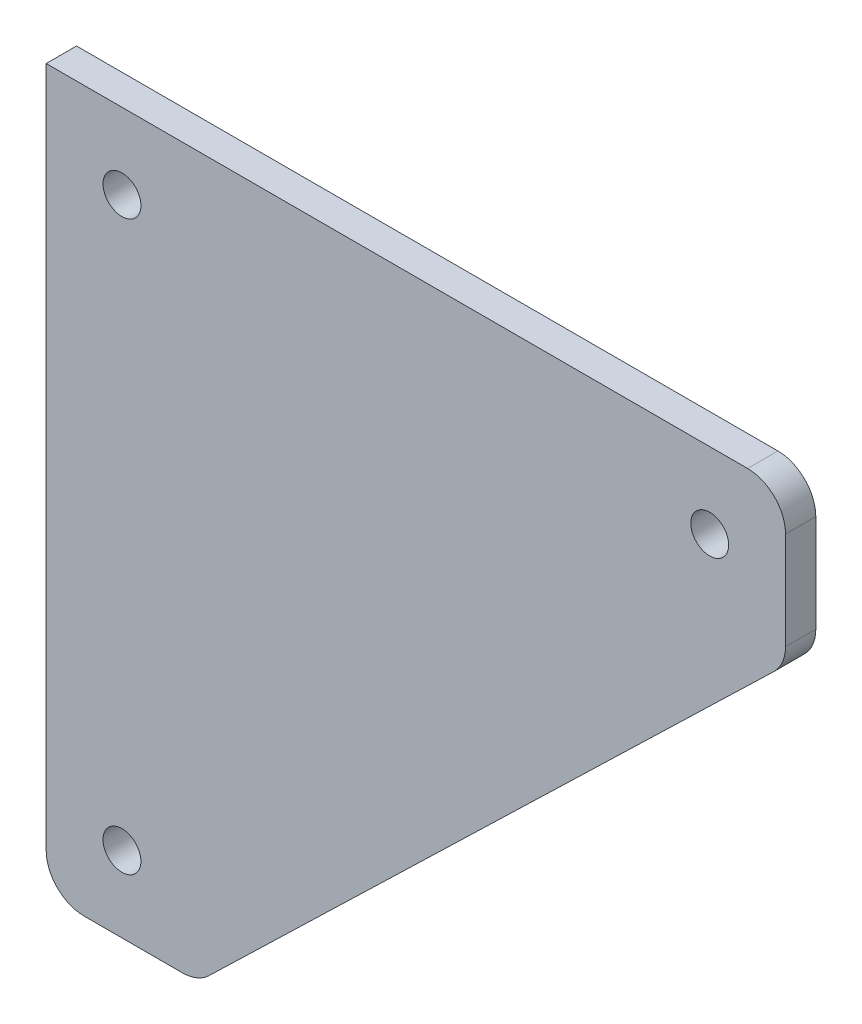
ISO-10303-21;
HEADER;
FILE_DESCRIPTION(('STEP AP214'),'2;1');
FILE_NAME('part.step','',(''),(''),'','','');
FILE_SCHEMA(('AUTOMOTIVE_DESIGN { 1 0 10303 214 1 1 1 1 }'));
ENDSEC;
DATA;
#1=APPLICATION_CONTEXT('core data for automotive mechanical design processes');
#2=APPLICATION_PROTOCOL_DEFINITION('international standard','automotive_design',2000,#1);
#3=PRODUCT_CONTEXT('',#1,'mechanical');
#4=PRODUCT('Part','Part','',(#3));
#5=PRODUCT_RELATED_PRODUCT_CATEGORY('part','',(#4));
#6=PRODUCT_DEFINITION_FORMATION('','',#4);
#7=PRODUCT_DEFINITION_CONTEXT('part definition',#1,'design');
#8=PRODUCT_DEFINITION('design','',#6,#7);
#9=PRODUCT_DEFINITION_SHAPE('','',#8);
#10=(LENGTH_UNIT() NAMED_UNIT(*) SI_UNIT(.MILLI.,.METRE.));
#11=(NAMED_UNIT(*) PLANE_ANGLE_UNIT() SI_UNIT($,.RADIAN.));
#12=(NAMED_UNIT(*) SI_UNIT($,.STERADIAN.) SOLID_ANGLE_UNIT());
#13=UNCERTAINTY_MEASURE_WITH_UNIT(LENGTH_MEASURE(1.E-05),#10,'distance_accuracy_value','');
#14=(GEOMETRIC_REPRESENTATION_CONTEXT(3) GLOBAL_UNCERTAINTY_ASSIGNED_CONTEXT((#13)) GLOBAL_UNIT_ASSIGNED_CONTEXT((#10,
#11,#12)) REPRESENTATION_CONTEXT('',''));
#15=CARTESIAN_POINT('',(0.,0.,0.));
#16=DIRECTION('',(0.,0.,1.));
#17=DIRECTION('',(1.,0.,0.));
#18=AXIS2_PLACEMENT_3D('',#15,#16,#17);
#19=CARTESIAN_POINT('',(-46.4575894502902,-53.7984404291404,4.));
#20=DIRECTION('',(1.,0.,0.));
#21=DIRECTION('',(0.,1.,0.));
#22=AXIS2_PLACEMENT_3D('',#19,#20,#21);
#23=PLANE('',#22);
#24=DIRECTION('',(0.,-1.,0.));
#25=VECTOR('',#24,1.);
#26=CARTESIAN_POINT('',(-46.4575894502902,-53.7984404291404,0.));
#27=LINE('',#26,#25);
#28=CARTESIAN_POINT('',(-46.4575894502902,41.1510545203546,0.));
#29=VERTEX_POINT('',#28);
#30=CARTESIAN_POINT('',(-46.4575894502902,-48.7984404291404,0.));
#31=VERTEX_POINT('',#30);
#32=EDGE_CURVE('E141',#29,#31,#27,.T.);
#33=ORIENTED_EDGE('',*,*,#32,.T.);
#34=DIRECTION('',(0.,0.,-1.));
#35=VECTOR('',#34,1.);
#36=CARTESIAN_POINT('',(-46.4575894502902,-48.7984404291404,4.));
#37=LINE('',#36,#35);
#38=CARTESIAN_POINT('',(-46.4575894502902,-48.7984404291404,4.));
#39=VERTEX_POINT('',#38);
#40=EDGE_CURVE('E11',#31,#39,#37,.F.);
#41=ORIENTED_EDGE('',*,*,#40,.T.);
#42=DIRECTION('',(0.,-1.,0.));
#43=VECTOR('',#42,1.);
#44=CARTESIAN_POINT('',(-46.4575894502902,-53.7984404291404,4.));
#45=LINE('',#44,#43);
#46=CARTESIAN_POINT('',(-46.4575894502902,41.1510545203546,4.));
#47=VERTEX_POINT('',#46);
#48=EDGE_CURVE('E109',#47,#39,#45,.T.);
#49=ORIENTED_EDGE('',*,*,#48,.F.);
#50=DIRECTION('',(0.,0.,-1.));
#51=VECTOR('',#50,1.);
#52=CARTESIAN_POINT('',(-46.4575894502902,41.1510545203546,4.));
#53=LINE('',#52,#51);
#54=EDGE_CURVE('E116',#47,#29,#53,.T.);
#55=ORIENTED_EDGE('',*,*,#54,.T.);
#56=EDGE_LOOP('',(#33,#41,#49,#55));
#57=FACE_BOUND('',#56,.T.);
#58=ADVANCED_FACE('F33',(#57),#23,.F.);
#59=CARTESIAN_POINT('',(-26.4575894502902,-53.7984404291404,4.));
#60=DIRECTION('',(0.,1.,0.));
#61=DIRECTION('',(-1.,0.,0.));
#62=AXIS2_PLACEMENT_3D('',#59,#60,#61);
#63=PLANE('',#62);
#64=DIRECTION('',(1.,0.,0.));
#65=VECTOR('',#64,1.);
#66=CARTESIAN_POINT('',(-26.4575894502902,-53.7984404291404,0.));
#67=LINE('',#66,#65);
#68=CARTESIAN_POINT('',(-41.4575894502902,-53.7984404291404,0.));
#69=VERTEX_POINT('',#68);
#70=CARTESIAN_POINT('',(-28.4784082332616,-53.7984404291404,0.));
#71=VERTEX_POINT('',#70);
#72=EDGE_CURVE('E143',#69,#71,#67,.T.);
#73=ORIENTED_EDGE('',*,*,#72,.T.);
#74=DIRECTION('',(0.,0.,-1.));
#75=VECTOR('',#74,1.);
#76=CARTESIAN_POINT('',(-28.4784082332616,-53.7984404291404,4.));
#77=LINE('',#76,#75);
#78=CARTESIAN_POINT('',(-28.4784082332616,-53.7984404291404,4.));
#79=VERTEX_POINT('',#78);
#80=EDGE_CURVE('E41',#71,#79,#77,.F.);
#81=ORIENTED_EDGE('',*,*,#80,.T.);
#82=DIRECTION('',(1.,0.,0.));
#83=VECTOR('',#82,1.);
#84=CARTESIAN_POINT('',(-26.4575894502902,-53.7984404291404,4.));
#85=LINE('',#84,#83);
#86=CARTESIAN_POINT('',(-41.4575894502902,-53.7984404291404,4.));
#87=VERTEX_POINT('',#86);
#88=EDGE_CURVE('E129',#87,#79,#85,.T.);
#89=ORIENTED_EDGE('',*,*,#88,.F.);
#90=DIRECTION('',(0.,0.,-1.));
#91=VECTOR('',#90,1.);
#92=CARTESIAN_POINT('',(-41.4575894502902,-53.7984404291404,4.));
#93=LINE('',#92,#91);
#94=EDGE_CURVE('E175',#87,#69,#93,.T.);
#95=ORIENTED_EDGE('',*,*,#94,.T.);
#96=EDGE_LOOP('',(#73,#81,#89,#95));
#97=FACE_BOUND('',#96,.T.);
#98=ADVANCED_FACE('F180',(#97),#63,.F.);
#99=CARTESIAN_POINT('',(51.1181681254674,21.1510545203546,4.));
#100=DIRECTION('',(-0.694828439518466,0.719175527695662,0.));
#101=DIRECTION('',(-0.719175527695662,-0.694828439518466,0.));
#102=AXIS2_PLACEMENT_3D('',#99,#100,#101);
#103=PLANE('',#102);
#104=DIRECTION('',(0.719175527695662,0.694828439518466,0.));
#105=VECTOR('',#104,1.);
#106=CARTESIAN_POINT('',(51.1181681254674,21.1510545203546,0.));
#107=LINE('',#106,#105);
#108=CARTESIAN_POINT('',(-25.0042660356693,-52.3943180676187,0.));
#109=VERTEX_POINT('',#108);
#110=CARTESIAN_POINT('',(49.5923103230598,19.6768533622992,0.));
#111=VERTEX_POINT('',#110);
#112=EDGE_CURVE('E147',#109,#111,#107,.T.);
#113=ORIENTED_EDGE('',*,*,#112,.T.);
#114=DIRECTION('',(0.,0.,-1.));
#115=VECTOR('',#114,1.);
#116=CARTESIAN_POINT('',(49.5923103230598,19.6768533622992,4.));
#117=LINE('',#116,#115);
#118=CARTESIAN_POINT('',(49.5923103230598,19.6768533622992,4.));
#119=VERTEX_POINT('',#118);
#120=EDGE_CURVE('E48',#111,#119,#117,.F.);
#121=ORIENTED_EDGE('',*,*,#120,.T.);
#122=DIRECTION('',(0.719175527695662,0.694828439518466,0.));
#123=VECTOR('',#122,1.);
#124=CARTESIAN_POINT('',(51.1181681254674,21.1510545203546,4.));
#125=LINE('',#124,#123);
#126=CARTESIAN_POINT('',(-25.0042660356693,-52.3943180676187,4.));
#127=VERTEX_POINT('',#126);
#128=EDGE_CURVE('E131',#127,#119,#125,.T.);
#129=ORIENTED_EDGE('',*,*,#128,.F.);
#130=DIRECTION('',(0.,0.,-1.));
#131=VECTOR('',#130,1.);
#132=CARTESIAN_POINT('',(-25.0042660356693,-52.3943180676187,4.));
#133=LINE('',#132,#131);
#134=EDGE_CURVE('E171',#127,#109,#133,.T.);
#135=ORIENTED_EDGE('',*,*,#134,.T.);
#136=EDGE_LOOP('',(#113,#121,#129,#135));
#137=FACE_BOUND('',#136,.T.);
#138=ADVANCED_FACE('F187',(#137),#103,.F.);
#139=CARTESIAN_POINT('',(51.1181681254674,41.1510545203546,4.));
#140=DIRECTION('',(-1.,0.,0.));
#141=DIRECTION('',(0.,0.,1.));
#142=AXIS2_PLACEMENT_3D('',#139,#140,#141);
#143=PLANE('',#142);
#144=DIRECTION('',(0.,1.,0.));
#145=VECTOR('',#144,1.);
#146=CARTESIAN_POINT('',(51.1181681254674,41.1510545203546,0.));
#147=LINE('',#146,#145);
#148=CARTESIAN_POINT('',(51.1181681254674,23.2727310007776,0.));
#149=VERTEX_POINT('',#148);
#150=CARTESIAN_POINT('',(51.1181681254674,36.1510545203546,0.));
#151=VERTEX_POINT('',#150);
#152=EDGE_CURVE('E133',#149,#151,#147,.T.);
#153=ORIENTED_EDGE('',*,*,#152,.T.);
#154=DIRECTION('',(0.,0.,-1.));
#155=VECTOR('',#154,1.);
#156=CARTESIAN_POINT('',(51.1181681254674,36.1510545203546,4.));
#157=LINE('',#156,#155);
#158=CARTESIAN_POINT('',(51.1181681254674,36.1510545203546,4.));
#159=VERTEX_POINT('',#158);
#160=EDGE_CURVE('E163',#151,#159,#157,.F.);
#161=ORIENTED_EDGE('',*,*,#160,.T.);
#162=DIRECTION('',(0.,1.,0.));
#163=VECTOR('',#162,1.);
#164=CARTESIAN_POINT('',(51.1181681254674,41.1510545203546,4.));
#165=LINE('',#164,#163);
#166=CARTESIAN_POINT('',(51.1181681254674,23.2727310007776,4.));
#167=VERTEX_POINT('',#166);
#168=EDGE_CURVE('E117',#167,#159,#165,.T.);
#169=ORIENTED_EDGE('',*,*,#168,.F.);
#170=DIRECTION('',(0.,0.,-1.));
#171=VECTOR('',#170,1.);
#172=CARTESIAN_POINT('',(51.1181681254674,23.2727310007776,4.));
#173=LINE('',#172,#171);
#174=EDGE_CURVE('E160',#167,#149,#173,.T.);
#175=ORIENTED_EDGE('',*,*,#174,.T.);
#176=EDGE_LOOP('',(#153,#161,#169,#175));
#177=FACE_BOUND('',#176,.T.);
#178=ADVANCED_FACE('F197',(#177),#143,.F.);
#179=CARTESIAN_POINT('',(-46.4575894502902,41.1510545203546,4.));
#180=DIRECTION('',(0.,-1.,0.));
#181=DIRECTION('',(0.,0.,-1.));
#182=AXIS2_PLACEMENT_3D('',#179,#180,#181);
#183=PLANE('',#182);
#184=DIRECTION('',(-1.,0.,0.));
#185=VECTOR('',#184,1.);
#186=CARTESIAN_POINT('',(-46.4575894502902,41.1510545203546,4.));
#187=LINE('',#186,#185);
#188=CARTESIAN_POINT('',(46.1181681254674,41.1510545203546,4.));
#189=VERTEX_POINT('',#188);
#190=EDGE_CURVE('E104',#189,#47,#187,.T.);
#191=ORIENTED_EDGE('',*,*,#190,.F.);
#192=DIRECTION('',(0.,0.,-1.));
#193=VECTOR('',#192,1.);
#194=CARTESIAN_POINT('',(46.1181681254674,41.1510545203546,4.));
#195=LINE('',#194,#193);
#196=CARTESIAN_POINT('',(46.1181681254674,41.1510545203546,0.));
#197=VERTEX_POINT('',#196);
#198=EDGE_CURVE('E126',#189,#197,#195,.T.);
#199=ORIENTED_EDGE('',*,*,#198,.T.);
#200=DIRECTION('',(-1.,0.,0.));
#201=VECTOR('',#200,1.);
#202=CARTESIAN_POINT('',(-46.4575894502902,41.1510545203546,0.));
#203=LINE('',#202,#201);
#204=EDGE_CURVE('E122',#197,#29,#203,.T.);
#205=ORIENTED_EDGE('',*,*,#204,.T.);
#206=ORIENTED_EDGE('',*,*,#54,.F.);
#207=EDGE_LOOP('',(#191,#199,#205,#206));
#208=FACE_BOUND('',#207,.T.);
#209=ADVANCED_FACE('F120',(#208),#183,.F.);
#210=CARTESIAN_POINT('',(0.,0.,4.));
#211=DIRECTION('',(0.,0.,-1.));
#212=DIRECTION('',(-1.,0.,0.));
#213=AXIS2_PLACEMENT_3D('',#210,#211,#212);
#214=PLANE('',#213);
#215=CARTESIAN_POINT('',(41.1181681254674,31.1510545203546,4.));
#216=DIRECTION('',(0.,0.,1.));
#217=DIRECTION('',(1.,0.,0.));
#218=AXIS2_PLACEMENT_3D('',#215,#216,#217);
#219=CIRCLE('',#218,2.5);
#220=CARTESIAN_POINT('',(43.6181681254674,31.1510545203546,4.));
#221=VERTEX_POINT('',#220);
#222=EDGE_CURVE('E320',#221,#221,#219,.T.);
#223=ORIENTED_EDGE('',*,*,#222,.F.);
#224=EDGE_LOOP('',(#223));
#225=FACE_BOUND('',#224,.T.);
#226=CARTESIAN_POINT('',(-36.4575894502902,-43.7984404291404,4.));
#227=DIRECTION('',(0.,0.,1.));
#228=DIRECTION('',(1.,0.,0.));
#229=AXIS2_PLACEMENT_3D('',#226,#227,#228);
#230=CIRCLE('',#229,2.5);
#231=CARTESIAN_POINT('',(-33.9575894502902,-43.7984404291404,4.));
#232=VERTEX_POINT('',#231);
#233=EDGE_CURVE('E324',#232,#232,#230,.T.);
#234=ORIENTED_EDGE('',*,*,#233,.F.);
#235=EDGE_LOOP('',(#234));
#236=FACE_BOUND('',#235,.T.);
#237=CARTESIAN_POINT('',(-36.4575894502902,31.1510545203546,4.));
#238=DIRECTION('',(0.,0.,1.));
#239=DIRECTION('',(1.,0.,0.));
#240=AXIS2_PLACEMENT_3D('',#237,#238,#239);
#241=CIRCLE('',#240,2.5);
#242=CARTESIAN_POINT('',(-33.9575894502902,31.1510545203546,4.));
#243=VERTEX_POINT('',#242);
#244=EDGE_CURVE('E136',#243,#243,#241,.T.);
#245=ORIENTED_EDGE('',*,*,#244,.F.);
#246=EDGE_LOOP('',(#245));
#247=FACE_BOUND('',#246,.T.);
#248=ORIENTED_EDGE('',*,*,#168,.T.);
#249=CARTESIAN_POINT('',(46.1181681254674,36.1510545203546,4.));
#250=DIRECTION('',(0.,0.,-1.));
#251=DIRECTION('',(-1.,0.,0.));
#252=AXIS2_PLACEMENT_3D('',#249,#250,#251);
#253=CIRCLE('',#252,5.);
#254=EDGE_CURVE('E112',#159,#189,#253,.F.);
#255=ORIENTED_EDGE('',*,*,#254,.T.);
#256=ORIENTED_EDGE('',*,*,#190,.T.);
#257=ORIENTED_EDGE('',*,*,#48,.T.);
#258=CARTESIAN_POINT('',(-41.4575894502902,-48.7984404291404,4.));
#259=DIRECTION('',(0.,0.,-1.));
#260=DIRECTION('',(-1.,0.,0.));
#261=AXIS2_PLACEMENT_3D('',#258,#259,#260);
#262=CIRCLE('',#261,5.);
#263=EDGE_CURVE('E165',#39,#87,#262,.F.);
#264=ORIENTED_EDGE('',*,*,#263,.T.);
#265=ORIENTED_EDGE('',*,*,#88,.T.);
#266=CARTESIAN_POINT('',(-28.4784082332616,-48.7984404291404,4.));
#267=DIRECTION('',(0.,0.,-1.));
#268=DIRECTION('',(-1.,0.,0.));
#269=AXIS2_PLACEMENT_3D('',#266,#267,#268);
#270=CIRCLE('',#269,5.);
#271=EDGE_CURVE('E55',#79,#127,#270,.F.);
#272=ORIENTED_EDGE('',*,*,#271,.T.);
#273=ORIENTED_EDGE('',*,*,#128,.T.);
#274=CARTESIAN_POINT('',(46.1181681254674,23.2727310007776,4.));
#275=DIRECTION('',(0.,0.,-1.));
#276=DIRECTION('',(-1.,0.,0.));
#277=AXIS2_PLACEMENT_3D('',#274,#275,#276);
#278=CIRCLE('',#277,5.);
#279=EDGE_CURVE('E168',#119,#167,#278,.F.);
#280=ORIENTED_EDGE('',*,*,#279,.T.);
#281=EDGE_LOOP('',(#248,#255,#256,#257,#264,#265,#272,#273,#280));
#282=FACE_BOUND('',#281,.T.);
#283=ADVANCED_FACE('F107',(#225,#236,#247,#282),#214,.F.);
#284=CARTESIAN_POINT('',(0.,0.,0.));
#285=DIRECTION('',(0.,0.,-1.));
#286=DIRECTION('',(-1.,0.,0.));
#287=AXIS2_PLACEMENT_3D('',#284,#285,#286);
#288=PLANE('',#287);
#289=CARTESIAN_POINT('',(41.1181681254674,31.1510545203546,0.));
#290=DIRECTION('',(0.,0.,1.));
#291=DIRECTION('',(1.,0.,0.));
#292=AXIS2_PLACEMENT_3D('',#289,#290,#291);
#293=CIRCLE('',#292,2.5);
#294=CARTESIAN_POINT('',(43.6181681254674,31.1510545203546,0.));
#295=VERTEX_POINT('',#294);
#296=EDGE_CURVE('E328',#295,#295,#293,.T.);
#297=ORIENTED_EDGE('',*,*,#296,.T.);
#298=EDGE_LOOP('',(#297));
#299=FACE_BOUND('',#298,.T.);
#300=CARTESIAN_POINT('',(-36.4575894502902,-43.7984404291404,0.));
#301=DIRECTION('',(0.,0.,1.));
#302=DIRECTION('',(1.,0.,0.));
#303=AXIS2_PLACEMENT_3D('',#300,#301,#302);
#304=CIRCLE('',#303,2.5);
#305=CARTESIAN_POINT('',(-33.9575894502902,-43.7984404291404,0.));
#306=VERTEX_POINT('',#305);
#307=EDGE_CURVE('E333',#306,#306,#304,.T.);
#308=ORIENTED_EDGE('',*,*,#307,.T.);
#309=EDGE_LOOP('',(#308));
#310=FACE_BOUND('',#309,.T.);
#311=CARTESIAN_POINT('',(-36.4575894502902,31.1510545203546,0.));
#312=DIRECTION('',(0.,0.,1.));
#313=DIRECTION('',(1.,0.,0.));
#314=AXIS2_PLACEMENT_3D('',#311,#312,#313);
#315=CIRCLE('',#314,2.5);
#316=CARTESIAN_POINT('',(-33.9575894502902,31.1510545203546,0.));
#317=VERTEX_POINT('',#316);
#318=EDGE_CURVE('E144',#317,#317,#315,.T.);
#319=ORIENTED_EDGE('',*,*,#318,.T.);
#320=EDGE_LOOP('',(#319));
#321=FACE_BOUND('',#320,.T.);
#322=ORIENTED_EDGE('',*,*,#204,.F.);
#323=CARTESIAN_POINT('',(46.1181681254674,36.1510545203546,0.));
#324=DIRECTION('',(0.,0.,-1.));
#325=DIRECTION('',(-1.,0.,0.));
#326=AXIS2_PLACEMENT_3D('',#323,#324,#325);
#327=CIRCLE('',#326,5.);
#328=EDGE_CURVE('E158',#197,#151,#327,.T.);
#329=ORIENTED_EDGE('',*,*,#328,.T.);
#330=ORIENTED_EDGE('',*,*,#152,.F.);
#331=CARTESIAN_POINT('',(46.1181681254674,23.2727310007776,0.));
#332=DIRECTION('',(0.,0.,-1.));
#333=DIRECTION('',(-1.,0.,0.));
#334=AXIS2_PLACEMENT_3D('',#331,#332,#333);
#335=CIRCLE('',#334,5.);
#336=EDGE_CURVE('E156',#149,#111,#335,.T.);
#337=ORIENTED_EDGE('',*,*,#336,.T.);
#338=ORIENTED_EDGE('',*,*,#112,.F.);
#339=CARTESIAN_POINT('',(-28.4784082332616,-48.7984404291404,0.));
#340=DIRECTION('',(0.,0.,-1.));
#341=DIRECTION('',(-1.,0.,0.));
#342=AXIS2_PLACEMENT_3D('',#339,#340,#341);
#343=CIRCLE('',#342,5.);
#344=EDGE_CURVE('E154',#109,#71,#343,.T.);
#345=ORIENTED_EDGE('',*,*,#344,.T.);
#346=ORIENTED_EDGE('',*,*,#72,.F.);
#347=CARTESIAN_POINT('',(-41.4575894502902,-48.7984404291404,0.));
#348=DIRECTION('',(0.,0.,-1.));
#349=DIRECTION('',(-1.,0.,0.));
#350=AXIS2_PLACEMENT_3D('',#347,#348,#349);
#351=CIRCLE('',#350,5.);
#352=EDGE_CURVE('E152',#69,#31,#351,.T.);
#353=ORIENTED_EDGE('',*,*,#352,.T.);
#354=ORIENTED_EDGE('',*,*,#32,.F.);
#355=EDGE_LOOP('',(#322,#329,#330,#337,#338,#345,#346,#353,#354));
#356=FACE_BOUND('',#355,.T.);
#357=ADVANCED_FACE('F189',(#299,#310,#321,#356),#288,.T.);
#358=CARTESIAN_POINT('',(-36.4575894502902,31.1510545203546,0.));
#359=DIRECTION('',(0.,0.,1.));
#360=DIRECTION('',(1.,0.,0.));
#361=AXIS2_PLACEMENT_3D('',#358,#359,#360);
#362=CYLINDRICAL_SURFACE('',#361,2.5);
#363=ORIENTED_EDGE('',*,*,#318,.F.);
#364=EDGE_LOOP('',(#363));
#365=FACE_BOUND('',#364,.T.);
#366=ORIENTED_EDGE('',*,*,#244,.T.);
#367=EDGE_LOOP('',(#366));
#368=FACE_BOUND('',#367,.T.);
#369=ADVANCED_FACE('F256',(#365,#368),#362,.F.);
#370=CARTESIAN_POINT('',(-36.4575894502902,-43.7984404291404,0.));
#371=DIRECTION('',(0.,0.,1.));
#372=DIRECTION('',(1.,0.,0.));
#373=AXIS2_PLACEMENT_3D('',#370,#371,#372);
#374=CYLINDRICAL_SURFACE('',#373,2.5);
#375=ORIENTED_EDGE('',*,*,#307,.F.);
#376=EDGE_LOOP('',(#375));
#377=FACE_BOUND('',#376,.T.);
#378=ORIENTED_EDGE('',*,*,#233,.T.);
#379=EDGE_LOOP('',(#378));
#380=FACE_BOUND('',#379,.T.);
#381=ADVANCED_FACE('F247',(#377,#380),#374,.F.);
#382=CARTESIAN_POINT('',(41.1181681254674,31.1510545203546,0.));
#383=DIRECTION('',(0.,0.,1.));
#384=DIRECTION('',(1.,0.,0.));
#385=AXIS2_PLACEMENT_3D('',#382,#383,#384);
#386=CYLINDRICAL_SURFACE('',#385,2.5);
#387=ORIENTED_EDGE('',*,*,#296,.F.);
#388=EDGE_LOOP('',(#387));
#389=FACE_BOUND('',#388,.T.);
#390=ORIENTED_EDGE('',*,*,#222,.T.);
#391=EDGE_LOOP('',(#390));
#392=FACE_BOUND('',#391,.T.);
#393=ADVANCED_FACE('F217',(#389,#392),#386,.F.);
#394=CARTESIAN_POINT('',(46.1181681254674,36.1510545203546,4.));
#395=DIRECTION('',(0.,0.,-1.));
#396=DIRECTION('',(-1.,0.,0.));
#397=AXIS2_PLACEMENT_3D('',#394,#395,#396);
#398=CYLINDRICAL_SURFACE('',#397,5.);
#399=ORIENTED_EDGE('',*,*,#254,.F.);
#400=ORIENTED_EDGE('',*,*,#160,.F.);
#401=ORIENTED_EDGE('',*,*,#328,.F.);
#402=ORIENTED_EDGE('',*,*,#198,.F.);
#403=EDGE_LOOP('',(#399,#400,#401,#402));
#404=FACE_BOUND('',#403,.T.);
#405=ADVANCED_FACE('F200',(#404),#398,.T.);
#406=CARTESIAN_POINT('',(46.1181681254674,23.2727310007776,4.));
#407=DIRECTION('',(0.,0.,-1.));
#408=DIRECTION('',(-1.,0.,0.));
#409=AXIS2_PLACEMENT_3D('',#406,#407,#408);
#410=CYLINDRICAL_SURFACE('',#409,5.);
#411=ORIENTED_EDGE('',*,*,#279,.F.);
#412=ORIENTED_EDGE('',*,*,#120,.F.);
#413=ORIENTED_EDGE('',*,*,#336,.F.);
#414=ORIENTED_EDGE('',*,*,#174,.F.);
#415=EDGE_LOOP('',(#411,#412,#413,#414));
#416=FACE_BOUND('',#415,.T.);
#417=ADVANCED_FACE('F194',(#416),#410,.T.);
#418=CARTESIAN_POINT('',(-28.4784082332616,-48.7984404291404,4.));
#419=DIRECTION('',(0.,0.,-1.));
#420=DIRECTION('',(-1.,0.,0.));
#421=AXIS2_PLACEMENT_3D('',#418,#419,#420);
#422=CYLINDRICAL_SURFACE('',#421,5.);
#423=ORIENTED_EDGE('',*,*,#271,.F.);
#424=ORIENTED_EDGE('',*,*,#80,.F.);
#425=ORIENTED_EDGE('',*,*,#344,.F.);
#426=ORIENTED_EDGE('',*,*,#134,.F.);
#427=EDGE_LOOP('',(#423,#424,#425,#426));
#428=FACE_BOUND('',#427,.T.);
#429=ADVANCED_FACE('F185',(#428),#422,.T.);
#430=CARTESIAN_POINT('',(-41.4575894502902,-48.7984404291404,4.));
#431=DIRECTION('',(0.,0.,-1.));
#432=DIRECTION('',(-1.,0.,0.));
#433=AXIS2_PLACEMENT_3D('',#430,#431,#432);
#434=CYLINDRICAL_SURFACE('',#433,5.);
#435=ORIENTED_EDGE('',*,*,#263,.F.);
#436=ORIENTED_EDGE('',*,*,#40,.F.);
#437=ORIENTED_EDGE('',*,*,#352,.F.);
#438=ORIENTED_EDGE('',*,*,#94,.F.);
#439=EDGE_LOOP('',(#435,#436,#437,#438));
#440=FACE_BOUND('',#439,.T.);
#441=ADVANCED_FACE('F35',(#440),#434,.T.);
#442=CLOSED_SHELL('',(#58,#98,#138,#178,#209,#283,#357,#369,#381,#393,#405,#417,#429,#441));
#443=MANIFOLD_SOLID_BREP('B2',#442);
#444=ADVANCED_BREP_SHAPE_REPRESENTATION('',(#18,#443),#14);
#445=SHAPE_DEFINITION_REPRESENTATION(#9,#444);
ENDSEC;
END-ISO-10303-21;
